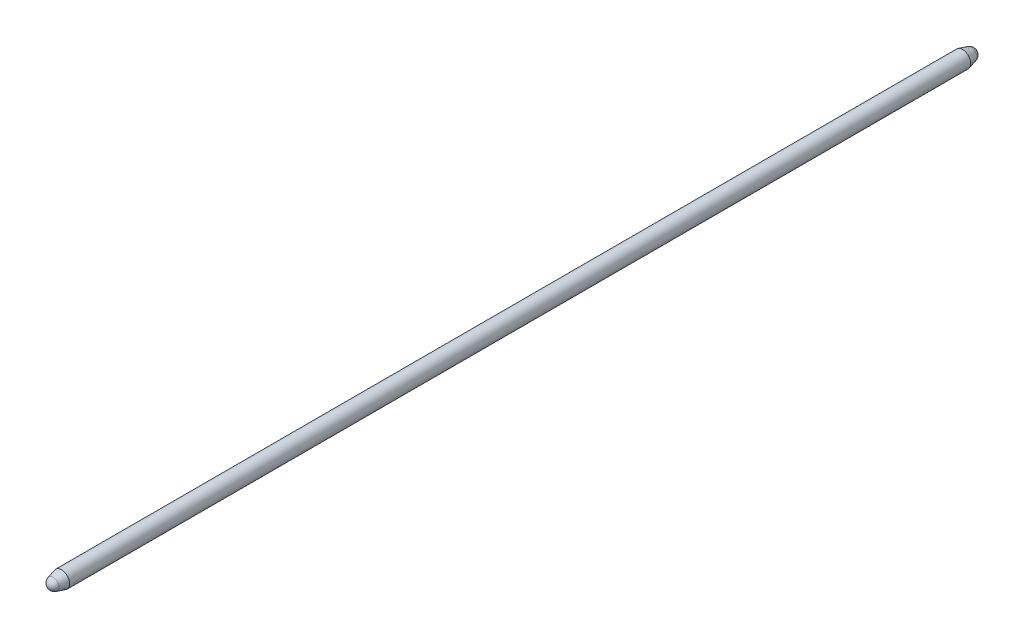
ISO-10303-21;
HEADER;
FILE_DESCRIPTION(('STEP AP214'),'2;1');
FILE_NAME('part.step','',(''),(''),'','','');
FILE_SCHEMA(('AUTOMOTIVE_DESIGN { 1 0 10303 214 1 1 1 1 }'));
ENDSEC;
DATA;
#1=APPLICATION_CONTEXT('core data for automotive mechanical design processes');
#2=APPLICATION_PROTOCOL_DEFINITION('international standard','automotive_design',2000,#1);
#3=PRODUCT_CONTEXT('',#1,'mechanical');
#4=PRODUCT('Part','Part','',(#3));
#5=PRODUCT_RELATED_PRODUCT_CATEGORY('part','',(#4));
#6=PRODUCT_DEFINITION_FORMATION('','',#4);
#7=PRODUCT_DEFINITION_CONTEXT('part definition',#1,'design');
#8=PRODUCT_DEFINITION('design','',#6,#7);
#9=PRODUCT_DEFINITION_SHAPE('','',#8);
#10=(LENGTH_UNIT() NAMED_UNIT(*) SI_UNIT(.MILLI.,.METRE.));
#11=(NAMED_UNIT(*) PLANE_ANGLE_UNIT() SI_UNIT($,.RADIAN.));
#12=(NAMED_UNIT(*) SI_UNIT($,.STERADIAN.) SOLID_ANGLE_UNIT());
#13=UNCERTAINTY_MEASURE_WITH_UNIT(LENGTH_MEASURE(1.E-05),#10,'distance_accuracy_value','');
#14=(GEOMETRIC_REPRESENTATION_CONTEXT(3) GLOBAL_UNCERTAINTY_ASSIGNED_CONTEXT((#13)) GLOBAL_UNIT_ASSIGNED_CONTEXT((#10,
#11,#12)) REPRESENTATION_CONTEXT('',''));
#15=CARTESIAN_POINT('',(0.,0.,0.));
#16=DIRECTION('',(0.,0.,1.));
#17=DIRECTION('',(1.,0.,0.));
#18=AXIS2_PLACEMENT_3D('',#15,#16,#17);
#19=CARTESIAN_POINT('',(0.,0.,-1421.1100269311));
#20=DIRECTION('',(0.,0.,-1.));
#21=DIRECTION('',(0.,1.,0.));
#22=AXIS2_PLACEMENT_3D('',#19,#20,#21);
#23=SPHERICAL_SURFACE('',#22,19.05);
#24=CARTESIAN_POINT('',(0.,0.,-1426.04052974031));
#25=DIRECTION('',(0.,0.,-1.));
#26=DIRECTION('',(0.,1.,0.));
#27=AXIS2_PLACEMENT_3D('',#24,#25,#26);
#28=CIRCLE('',#27,18.4008869908067);
#29=CARTESIAN_POINT('',(0.,18.4008869908068,-1426.04052974031));
#30=VERTEX_POINT('',#29);
#31=EDGE_CURVE('E10',#30,#30,#28,.T.);
#32=ORIENTED_EDGE('',*,*,#31,.T.);
#33=EDGE_LOOP('',(#32));
#34=FACE_BOUND('',#33,.T.);
#35=ADVANCED_FACE('F31',(#34),#23,.T.);
#36=CARTESIAN_POINT('',(0.,0.,-1426.04052974031));
#37=DIRECTION('',(0.,0.,1.));
#38=DIRECTION('',(0.,-1.,0.));
#39=AXIS2_PLACEMENT_3D('',#36,#37,#38);
#40=CONICAL_SURFACE('',#39,18.4008869908067,0.26179938779915);
#41=CARTESIAN_POINT('',(0.,0.,-1399.91948438208));
#42=DIRECTION('',(0.,0.,-1.));
#43=DIRECTION('',(0.,1.,0.));
#44=AXIS2_PLACEMENT_3D('',#41,#42,#43);
#45=CIRCLE('',#44,25.4);
#46=CARTESIAN_POINT('',(0.,25.4,-1399.91948438208));
#47=VERTEX_POINT('',#46);
#48=EDGE_CURVE('E38',#47,#47,#45,.T.);
#49=ORIENTED_EDGE('',*,*,#48,.T.);
#50=EDGE_LOOP('',(#49));
#51=FACE_BOUND('',#50,.T.);
#52=ORIENTED_EDGE('',*,*,#31,.F.);
#53=EDGE_LOOP('',(#52));
#54=FACE_BOUND('',#53,.T.);
#55=ADVANCED_FACE('F86',(#51,#54),#40,.T.);
#56=CARTESIAN_POINT('',(0.,0.,-1440.1600269311));
#57=DIRECTION('',(0.,0.,-1.));
#58=DIRECTION('',(0.,1.,0.));
#59=AXIS2_PLACEMENT_3D('',#56,#57,#58);
#60=CYLINDRICAL_SURFACE('',#59,25.4);
#61=CARTESIAN_POINT('',(0.,0.,1399.91948438208));
#62=DIRECTION('',(0.,0.,-1.));
#63=DIRECTION('',(0.,1.,0.));
#64=AXIS2_PLACEMENT_3D('',#61,#62,#63);
#65=CIRCLE('',#64,25.4);
#66=CARTESIAN_POINT('',(0.,25.4,1399.91948438208));
#67=VERTEX_POINT('',#66);
#68=EDGE_CURVE('E42',#67,#67,#65,.T.);
#69=ORIENTED_EDGE('',*,*,#68,.T.);
#70=EDGE_LOOP('',(#69));
#71=FACE_BOUND('',#70,.T.);
#72=ORIENTED_EDGE('',*,*,#48,.F.);
#73=EDGE_LOOP('',(#72));
#74=FACE_BOUND('',#73,.T.);
#75=ADVANCED_FACE('F83',(#71,#74),#60,.T.);
#76=CARTESIAN_POINT('',(0.,0.,1399.91948438208));
#77=DIRECTION('',(0.,0.,-1.));
#78=DIRECTION('',(0.,1.,0.));
#79=AXIS2_PLACEMENT_3D('',#76,#77,#78);
#80=CONICAL_SURFACE('',#79,25.4,0.26179938779915);
#81=CARTESIAN_POINT('',(0.,0.,1426.04052974031));
#82=DIRECTION('',(0.,0.,-1.));
#83=DIRECTION('',(0.,1.,0.));
#84=AXIS2_PLACEMENT_3D('',#81,#82,#83);
#85=CIRCLE('',#84,18.4008869908068);
#86=CARTESIAN_POINT('',(0.,18.4008869908068,1426.04052974031));
#87=VERTEX_POINT('',#86);
#88=EDGE_CURVE('E46',#87,#87,#85,.T.);
#89=ORIENTED_EDGE('',*,*,#88,.T.);
#90=EDGE_LOOP('',(#89));
#91=FACE_BOUND('',#90,.T.);
#92=ORIENTED_EDGE('',*,*,#68,.F.);
#93=EDGE_LOOP('',(#92));
#94=FACE_BOUND('',#93,.T.);
#95=ADVANCED_FACE('F79',(#91,#94),#80,.T.);
#96=CARTESIAN_POINT('',(0.,0.,1421.1100269311));
#97=DIRECTION('',(0.,0.,-1.));
#98=DIRECTION('',(0.,1.,0.));
#99=AXIS2_PLACEMENT_3D('',#96,#97,#98);
#100=SPHERICAL_SURFACE('',#99,19.05);
#101=ORIENTED_EDGE('',*,*,#88,.F.);
#102=EDGE_LOOP('',(#101));
#103=FACE_BOUND('',#102,.T.);
#104=ADVANCED_FACE('F77',(#103),#100,.T.);
#105=CLOSED_SHELL('',(#35,#55,#75,#95,#104));
#106=CARTESIAN_POINT('',(0.,0.,1399.91948438208));
#107=DIRECTION('',(0.,0.,-1.));
#108=DIRECTION('',(0.,1.,0.));
#109=AXIS2_PLACEMENT_3D('',#106,#107,#108);
#110=PLANE('',#109);
#111=CARTESIAN_POINT('',(0.,0.,1399.91948438208));
#112=DIRECTION('',(0.,0.,-1.));
#113=DIRECTION('',(0.,1.,0.));
#114=AXIS2_PLACEMENT_3D('',#111,#112,#113);
#115=CIRCLE('',#114,22.987);
#116=CARTESIAN_POINT('',(0.,22.987,1399.91948438208));
#117=VERTEX_POINT('',#116);
#118=EDGE_CURVE('E51',#117,#117,#115,.T.);
#119=ORIENTED_EDGE('',*,*,#118,.T.);
#120=EDGE_LOOP('',(#119));
#121=FACE_BOUND('',#120,.T.);
#122=ADVANCED_FACE('F68',(#121),#110,.T.);
#123=CARTESIAN_POINT('',(0.,0.,-1440.1600269311));
#124=DIRECTION('',(0.,0.,-1.));
#125=DIRECTION('',(0.,1.,0.));
#126=AXIS2_PLACEMENT_3D('',#123,#124,#125);
#127=CYLINDRICAL_SURFACE('',#126,22.987);
#128=CARTESIAN_POINT('',(0.,0.,-1399.91948438208));
#129=DIRECTION('',(0.,0.,-1.));
#130=DIRECTION('',(0.,1.,0.));
#131=AXIS2_PLACEMENT_3D('',#128,#129,#130);
#132=CIRCLE('',#131,22.987);
#133=CARTESIAN_POINT('',(0.,22.987,-1399.91948438208));
#134=VERTEX_POINT('',#133);
#135=EDGE_CURVE('E54',#134,#134,#132,.T.);
#136=ORIENTED_EDGE('',*,*,#135,.T.);
#137=EDGE_LOOP('',(#136));
#138=FACE_BOUND('',#137,.T.);
#139=ORIENTED_EDGE('',*,*,#118,.F.);
#140=EDGE_LOOP('',(#139));
#141=FACE_BOUND('',#140,.T.);
#142=ADVANCED_FACE('F58',(#138,#141),#127,.F.);
#143=CARTESIAN_POINT('',(0.,0.,-1399.91948438208));
#144=DIRECTION('',(0.,0.,1.));
#145=DIRECTION('',(0.,-1.,0.));
#146=AXIS2_PLACEMENT_3D('',#143,#144,#145);
#147=PLANE('',#146);
#148=ORIENTED_EDGE('',*,*,#135,.F.);
#149=EDGE_LOOP('',(#148));
#150=FACE_BOUND('',#149,.T.);
#151=ADVANCED_FACE('F61',(#150),#147,.T.);
#152=CLOSED_SHELL('',(#122,#142,#151));
#153=ORIENTED_CLOSED_SHELL('',*,#152,.T.);
#154=BREP_WITH_VOIDS('B2',#105,(#153));
#155=ADVANCED_BREP_SHAPE_REPRESENTATION('',(#18,#154),#14);
#156=SHAPE_DEFINITION_REPRESENTATION(#9,#155);
ENDSEC;
END-ISO-10303-21;
